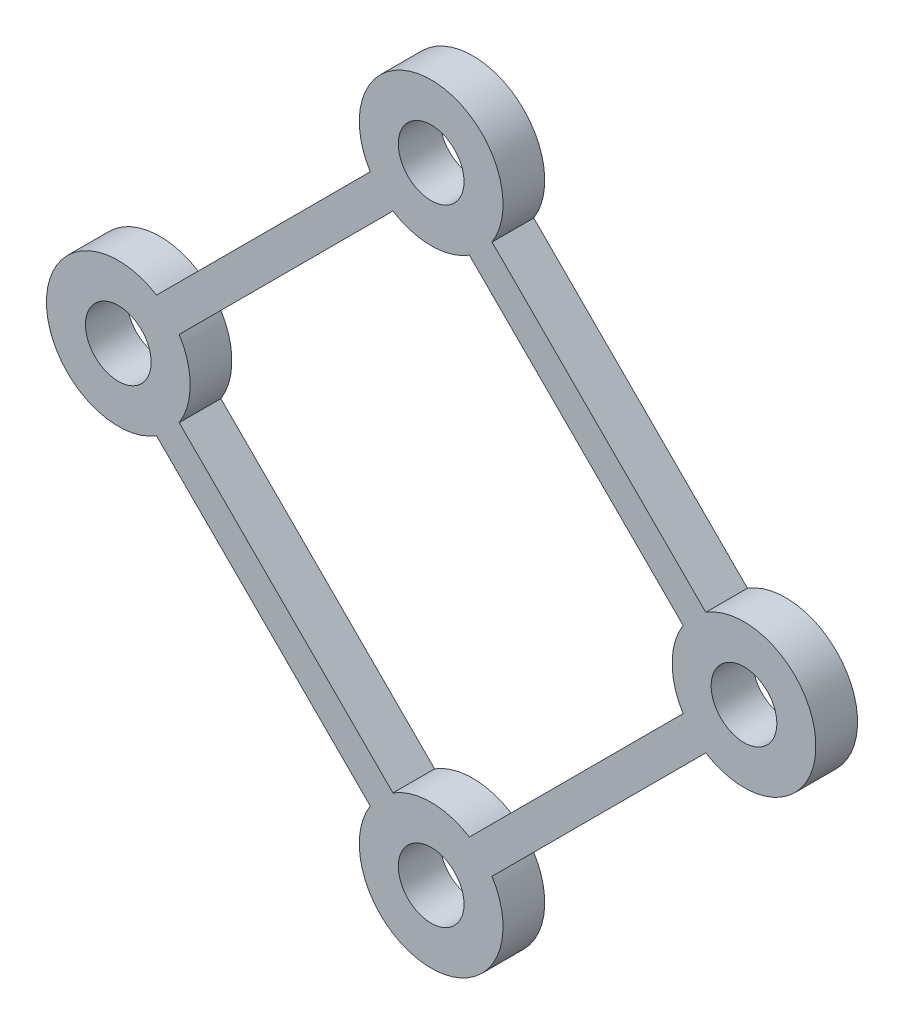
ISO-10303-21;
HEADER;
FILE_DESCRIPTION(('STEP AP214'),'2;1');
FILE_NAME('part.step','',(''),(''),'','','');
FILE_SCHEMA(('AUTOMOTIVE_DESIGN { 1 0 10303 214 1 1 1 1 }'));
ENDSEC;
DATA;
#1=APPLICATION_CONTEXT('core data for automotive mechanical design processes');
#2=APPLICATION_PROTOCOL_DEFINITION('international standard','automotive_design',2000,#1);
#3=PRODUCT_CONTEXT('',#1,'mechanical');
#4=PRODUCT('Part','Part','',(#3));
#5=PRODUCT_RELATED_PRODUCT_CATEGORY('part','',(#4));
#6=PRODUCT_DEFINITION_FORMATION('','',#4);
#7=PRODUCT_DEFINITION_CONTEXT('part definition',#1,'design');
#8=PRODUCT_DEFINITION('design','',#6,#7);
#9=PRODUCT_DEFINITION_SHAPE('','',#8);
#10=(LENGTH_UNIT() NAMED_UNIT(*) SI_UNIT(.MILLI.,.METRE.));
#11=(NAMED_UNIT(*) PLANE_ANGLE_UNIT() SI_UNIT($,.RADIAN.));
#12=(NAMED_UNIT(*) SI_UNIT($,.STERADIAN.) SOLID_ANGLE_UNIT());
#13=UNCERTAINTY_MEASURE_WITH_UNIT(LENGTH_MEASURE(1.E-05),#10,'distance_accuracy_value','');
#14=(GEOMETRIC_REPRESENTATION_CONTEXT(3) GLOBAL_UNCERTAINTY_ASSIGNED_CONTEXT((#13)) GLOBAL_UNIT_ASSIGNED_CONTEXT((#10,
#11,#12)) REPRESENTATION_CONTEXT('',''));
#15=CARTESIAN_POINT('',(0.,0.,0.));
#16=DIRECTION('',(0.,0.,1.));
#17=DIRECTION('',(1.,0.,0.));
#18=AXIS2_PLACEMENT_3D('',#15,#16,#17);
#19=CARTESIAN_POINT('',(3.42573895329532,3.22486475356174,3.3));
#20=DIRECTION('',(0.,0.,1.));
#21=DIRECTION('',(1.,0.,0.));
#22=AXIS2_PLACEMENT_3D('',#19,#20,#21);
#23=PLANE('',#22);
#24=CARTESIAN_POINT('',(13.1838125336697,-6.53320882681261,3.3));
#25=DIRECTION('',(0.,0.,1.));
#26=DIRECTION('',(1.,0.,0.));
#27=AXIS2_PLACEMENT_3D('',#24,#25,#26);
#28=CIRCLE('',#27,1.025);
#29=CARTESIAN_POINT('',(14.2088125336697,-6.53320882681261,3.3));
#30=VERTEX_POINT('',#29);
#31=EDGE_CURVE('E456',#30,#30,#28,.T.);
#32=ORIENTED_EDGE('',*,*,#31,.F.);
#33=EDGE_LOOP('',(#32));
#34=FACE_BOUND('',#33,.T.);
#35=CARTESIAN_POINT('',(-6.33233462707904,-6.53320882681261,3.3));
#36=DIRECTION('',(0.,0.,1.));
#37=DIRECTION('',(1.,0.,0.));
#38=AXIS2_PLACEMENT_3D('',#35,#36,#37);
#39=CIRCLE('',#38,1.025);
#40=CARTESIAN_POINT('',(-5.30733462707904,-6.53320882681261,3.3));
#41=VERTEX_POINT('',#40);
#42=EDGE_CURVE('E213',#41,#41,#39,.T.);
#43=ORIENTED_EDGE('',*,*,#42,.F.);
#44=EDGE_LOOP('',(#43));
#45=FACE_BOUND('',#44,.T.);
#46=CARTESIAN_POINT('',(3.42573895329532,3.22486475356174,3.3));
#47=DIRECTION('',(0.,0.,1.));
#48=DIRECTION('',(1.,0.,0.));
#49=AXIS2_PLACEMENT_3D('',#46,#47,#48);
#50=CIRCLE('',#49,2.24192641962564);
#51=CARTESIAN_POINT('',(5.3246457130271,2.03306477501651,3.3));
#52=VERTEX_POINT('',#51);
#53=CARTESIAN_POINT('',(1.52683219356354,2.03306477501651,3.3));
#54=VERTEX_POINT('',#53);
#55=EDGE_CURVE('E257',#52,#54,#50,.T.);
#56=ORIENTED_EDGE('',*,*,#55,.T.);
#57=DIRECTION('',(-0.707106781186548,-0.707106781186547,0.));
#58=VECTOR('',#57,1.);
#59=CARTESIAN_POINT('',(-5.14053464853381,-4.63430206708084,3.3));
#60=LINE('',#59,#58);
#61=CARTESIAN_POINT('',(-5.14053464853381,-4.63430206708084,3.3));
#62=VERTEX_POINT('',#61);
#63=EDGE_CURVE('E261',#54,#62,#60,.T.);
#64=ORIENTED_EDGE('',*,*,#63,.T.);
#65=CARTESIAN_POINT('',(-6.33233462707904,-6.53320882681261,3.3));
#66=DIRECTION('',(0.,0.,1.));
#67=DIRECTION('',(1.,0.,0.));
#68=AXIS2_PLACEMENT_3D('',#65,#66,#67);
#69=CIRCLE('',#68,2.24192641962564);
#70=CARTESIAN_POINT('',(-5.14053464853381,-8.43211558654439,3.3));
#71=VERTEX_POINT('',#70);
#72=EDGE_CURVE('E265',#62,#71,#69,.T.);
#73=ORIENTED_EDGE('',*,*,#72,.T.);
#74=DIRECTION('',(0.707106781186548,-0.707106781186548,0.));
#75=VECTOR('',#74,1.);
#76=CARTESIAN_POINT('',(-5.14053464853381,-8.43211558654439,3.3));
#77=LINE('',#76,#75);
#78=CARTESIAN_POINT('',(1.52683219356354,-15.0994824286417,3.3));
#79=VERTEX_POINT('',#78);
#80=EDGE_CURVE('E268',#71,#79,#77,.T.);
#81=ORIENTED_EDGE('',*,*,#80,.T.);
#82=CARTESIAN_POINT('',(3.42573895329532,-16.291282407187,3.3));
#83=DIRECTION('',(0.,0.,1.));
#84=DIRECTION('',(1.,0.,0.));
#85=AXIS2_PLACEMENT_3D('',#82,#83,#84);
#86=CIRCLE('',#85,2.24192641962564);
#87=CARTESIAN_POINT('',(5.32464571302709,-15.0994824286417,3.3));
#88=VERTEX_POINT('',#87);
#89=EDGE_CURVE('E271',#79,#88,#86,.T.);
#90=ORIENTED_EDGE('',*,*,#89,.T.);
#91=DIRECTION('',(0.707106781186547,0.707106781186548,0.));
#92=VECTOR('',#91,1.);
#93=CARTESIAN_POINT('',(5.32464571302709,-15.0994824286417,3.3));
#94=LINE('',#93,#92);
#95=CARTESIAN_POINT('',(11.9920125551244,-8.43211558654439,3.3));
#96=VERTEX_POINT('',#95);
#97=EDGE_CURVE('E274',#88,#96,#94,.T.);
#98=ORIENTED_EDGE('',*,*,#97,.T.);
#99=CARTESIAN_POINT('',(13.1838125336697,-6.53320882681261,3.3));
#100=DIRECTION('',(0.,0.,1.));
#101=DIRECTION('',(1.,0.,0.));
#102=AXIS2_PLACEMENT_3D('',#99,#100,#101);
#103=CIRCLE('',#102,2.24192641962564);
#104=CARTESIAN_POINT('',(11.9920125551244,-4.63430206708083,3.3));
#105=VERTEX_POINT('',#104);
#106=EDGE_CURVE('E277',#96,#105,#103,.T.);
#107=ORIENTED_EDGE('',*,*,#106,.T.);
#108=DIRECTION('',(-0.707106781186548,0.707106781186547,0.));
#109=VECTOR('',#108,1.);
#110=CARTESIAN_POINT('',(5.3246457130271,2.03306477501651,3.3));
#111=LINE('',#110,#109);
#112=EDGE_CURVE('E280',#105,#52,#111,.T.);
#113=ORIENTED_EDGE('',*,*,#112,.T.);
#114=EDGE_LOOP('',(#56,#64,#73,#81,#90,#98,#107,#113));
#115=FACE_BOUND('',#114,.T.);
#116=DIRECTION('',(0.707106781186548,-0.707106781186547,0.));
#117=VECTOR('',#116,1.);
#118=CARTESIAN_POINT('',(-4.43342786734726,-7.72500880535784,3.3));
#119=LINE('',#118,#117);
#120=CARTESIAN_POINT('',(-4.43342786734726,-7.72500880535784,3.3));
#121=VERTEX_POINT('',#120);
#122=CARTESIAN_POINT('',(2.23393897475009,-14.3923756474552,3.3));
#123=VERTEX_POINT('',#122);
#124=EDGE_CURVE('E174',#121,#123,#119,.T.);
#125=ORIENTED_EDGE('',*,*,#124,.F.);
#126=CARTESIAN_POINT('',(-6.33233462707904,-6.53320882681261,3.3));
#127=DIRECTION('',(0.,0.,-1.));
#128=DIRECTION('',(1.,0.,0.));
#129=AXIS2_PLACEMENT_3D('',#126,#127,#128);
#130=CIRCLE('',#129,2.24192641962564);
#131=CARTESIAN_POINT('',(-4.43342786734726,-5.34140884826738,3.3));
#132=VERTEX_POINT('',#131);
#133=EDGE_CURVE('E165',#132,#121,#130,.T.);
#134=ORIENTED_EDGE('',*,*,#133,.F.);
#135=DIRECTION('',(-0.707106781186548,-0.707106781186547,0.));
#136=VECTOR('',#135,1.);
#137=CARTESIAN_POINT('',(-4.43342786734726,-5.34140884826738,3.3));
#138=LINE('',#137,#136);
#139=CARTESIAN_POINT('',(2.23393897475009,1.32595799382997,3.3));
#140=VERTEX_POINT('',#139);
#141=EDGE_CURVE('E208',#140,#132,#138,.T.);
#142=ORIENTED_EDGE('',*,*,#141,.F.);
#143=CARTESIAN_POINT('',(3.42573895329532,3.22486475356174,3.3));
#144=DIRECTION('',(0.,0.,-1.));
#145=DIRECTION('',(1.,0.,0.));
#146=AXIS2_PLACEMENT_3D('',#143,#144,#145);
#147=CIRCLE('',#146,2.24192641962564);
#148=CARTESIAN_POINT('',(4.61753893184055,1.32595799382997,3.3));
#149=VERTEX_POINT('',#148);
#150=EDGE_CURVE('E205',#149,#140,#147,.T.);
#151=ORIENTED_EDGE('',*,*,#150,.F.);
#152=DIRECTION('',(-0.707106781186548,0.707106781186547,0.));
#153=VECTOR('',#152,1.);
#154=CARTESIAN_POINT('',(4.61753893184055,1.32595799382997,3.3));
#155=LINE('',#154,#153);
#156=CARTESIAN_POINT('',(11.2849057739379,-5.34140884826738,3.3));
#157=VERTEX_POINT('',#156);
#158=EDGE_CURVE('E202',#157,#149,#155,.T.);
#159=ORIENTED_EDGE('',*,*,#158,.F.);
#160=CARTESIAN_POINT('',(13.1838125336697,-6.53320882681261,3.3));
#161=DIRECTION('',(0.,0.,-1.));
#162=DIRECTION('',(1.,0.,0.));
#163=AXIS2_PLACEMENT_3D('',#160,#161,#162);
#164=CIRCLE('',#163,2.24192641962564);
#165=CARTESIAN_POINT('',(11.2849057739379,-7.72500880535785,3.3));
#166=VERTEX_POINT('',#165);
#167=EDGE_CURVE('E199',#166,#157,#164,.T.);
#168=ORIENTED_EDGE('',*,*,#167,.F.);
#169=DIRECTION('',(0.707106781186548,0.707106781186548,0.));
#170=VECTOR('',#169,1.);
#171=CARTESIAN_POINT('',(4.61753893184055,-14.3923756474552,3.3));
#172=LINE('',#171,#170);
#173=CARTESIAN_POINT('',(4.61753893184055,-14.3923756474552,3.3));
#174=VERTEX_POINT('',#173);
#175=EDGE_CURVE('E193',#174,#166,#172,.T.);
#176=ORIENTED_EDGE('',*,*,#175,.F.);
#177=CARTESIAN_POINT('',(3.42573895329532,-16.291282407187,3.3));
#178=DIRECTION('',(0.,0.,-1.));
#179=DIRECTION('',(1.,0.,0.));
#180=AXIS2_PLACEMENT_3D('',#177,#178,#179);
#181=CIRCLE('',#180,2.24192641962564);
#182=EDGE_CURVE('E189',#123,#174,#181,.T.);
#183=ORIENTED_EDGE('',*,*,#182,.F.);
#184=EDGE_LOOP('',(#125,#134,#142,#151,#159,#168,#176,#183));
#185=FACE_BOUND('',#184,.T.);
#186=CARTESIAN_POINT('',(3.42573895329532,3.22486475356174,3.3));
#187=DIRECTION('',(0.,0.,1.));
#188=DIRECTION('',(1.,0.,0.));
#189=AXIS2_PLACEMENT_3D('',#186,#187,#188);
#190=CIRCLE('',#189,1.025);
#191=CARTESIAN_POINT('',(4.45073895329532,3.22486475356174,3.3));
#192=VERTEX_POINT('',#191);
#193=EDGE_CURVE('E464',#192,#192,#190,.T.);
#194=ORIENTED_EDGE('',*,*,#193,.F.);
#195=EDGE_LOOP('',(#194));
#196=FACE_BOUND('',#195,.T.);
#197=CARTESIAN_POINT('',(3.42573895329532,-16.291282407187,3.3));
#198=DIRECTION('',(0.,0.,1.));
#199=DIRECTION('',(1.,0.,0.));
#200=AXIS2_PLACEMENT_3D('',#197,#198,#199);
#201=CIRCLE('',#200,1.025);
#202=CARTESIAN_POINT('',(4.45073895329532,-16.291282407187,3.3));
#203=VERTEX_POINT('',#202);
#204=EDGE_CURVE('E445',#203,#203,#201,.T.);
#205=ORIENTED_EDGE('',*,*,#204,.F.);
#206=EDGE_LOOP('',(#205));
#207=FACE_BOUND('',#206,.T.);
#208=ADVANCED_FACE('F51',(#34,#45,#115,#185,#196,#207),#23,.T.);
#209=CARTESIAN_POINT('',(3.42573895329532,3.22486475356174,2.));
#210=DIRECTION('',(0.,0.,1.));
#211=DIRECTION('',(1.,0.,0.));
#212=AXIS2_PLACEMENT_3D('',#209,#210,#211);
#213=PLANE('',#212);
#214=CARTESIAN_POINT('',(3.42573895329532,3.22486475356174,2.));
#215=DIRECTION('',(0.,0.,1.));
#216=DIRECTION('',(1.,0.,0.));
#217=AXIS2_PLACEMENT_3D('',#214,#215,#216);
#218=CIRCLE('',#217,2.24192641962564);
#219=CARTESIAN_POINT('',(5.3246457130271,2.03306477501651,2.));
#220=VERTEX_POINT('',#219);
#221=CARTESIAN_POINT('',(1.52683219356354,2.03306477501651,2.));
#222=VERTEX_POINT('',#221);
#223=EDGE_CURVE('E183',#220,#222,#218,.T.);
#224=ORIENTED_EDGE('',*,*,#223,.F.);
#225=DIRECTION('',(-0.707106781186548,0.707106781186547,0.));
#226=VECTOR('',#225,1.);
#227=CARTESIAN_POINT('',(5.3246457130271,2.03306477501651,2.));
#228=LINE('',#227,#226);
#229=CARTESIAN_POINT('',(11.9920125551244,-4.63430206708083,2.));
#230=VERTEX_POINT('',#229);
#231=EDGE_CURVE('E262',#230,#220,#228,.T.);
#232=ORIENTED_EDGE('',*,*,#231,.F.);
#233=CARTESIAN_POINT('',(13.1838125336697,-6.53320882681261,2.));
#234=DIRECTION('',(0.,0.,1.));
#235=DIRECTION('',(1.,0.,0.));
#236=AXIS2_PLACEMENT_3D('',#233,#234,#235);
#237=CIRCLE('',#236,2.24192641962564);
#238=CARTESIAN_POINT('',(11.9920125551244,-8.43211558654439,2.));
#239=VERTEX_POINT('',#238);
#240=EDGE_CURVE('E302',#239,#230,#237,.T.);
#241=ORIENTED_EDGE('',*,*,#240,.F.);
#242=DIRECTION('',(0.707106781186547,0.707106781186548,0.));
#243=VECTOR('',#242,1.);
#244=CARTESIAN_POINT('',(5.32464571302709,-15.0994824286417,2.));
#245=LINE('',#244,#243);
#246=CARTESIAN_POINT('',(5.32464571302709,-15.0994824286417,2.));
#247=VERTEX_POINT('',#246);
#248=EDGE_CURVE('E299',#247,#239,#245,.T.);
#249=ORIENTED_EDGE('',*,*,#248,.F.);
#250=CARTESIAN_POINT('',(3.42573895329532,-16.291282407187,2.));
#251=DIRECTION('',(0.,0.,1.));
#252=DIRECTION('',(1.,0.,0.));
#253=AXIS2_PLACEMENT_3D('',#250,#251,#252);
#254=CIRCLE('',#253,2.24192641962564);
#255=CARTESIAN_POINT('',(1.52683219356354,-15.0994824286417,2.));
#256=VERTEX_POINT('',#255);
#257=EDGE_CURVE('E296',#256,#247,#254,.T.);
#258=ORIENTED_EDGE('',*,*,#257,.F.);
#259=DIRECTION('',(0.707106781186548,-0.707106781186548,0.));
#260=VECTOR('',#259,1.);
#261=CARTESIAN_POINT('',(-5.14053464853381,-8.43211558654439,2.));
#262=LINE('',#261,#260);
#263=CARTESIAN_POINT('',(-5.14053464853381,-8.43211558654439,2.));
#264=VERTEX_POINT('',#263);
#265=EDGE_CURVE('E293',#264,#256,#262,.T.);
#266=ORIENTED_EDGE('',*,*,#265,.F.);
#267=CARTESIAN_POINT('',(-6.33233462707904,-6.53320882681261,2.));
#268=DIRECTION('',(0.,0.,1.));
#269=DIRECTION('',(1.,0.,0.));
#270=AXIS2_PLACEMENT_3D('',#267,#268,#269);
#271=CIRCLE('',#270,2.24192641962564);
#272=CARTESIAN_POINT('',(-5.14053464853381,-4.63430206708084,2.));
#273=VERTEX_POINT('',#272);
#274=EDGE_CURVE('E290',#273,#264,#271,.T.);
#275=ORIENTED_EDGE('',*,*,#274,.F.);
#276=DIRECTION('',(-0.707106781186548,-0.707106781186547,0.));
#277=VECTOR('',#276,1.);
#278=CARTESIAN_POINT('',(-5.14053464853381,-4.63430206708084,2.));
#279=LINE('',#278,#277);
#280=EDGE_CURVE('E287',#222,#273,#279,.T.);
#281=ORIENTED_EDGE('',*,*,#280,.F.);
#282=EDGE_LOOP('',(#224,#232,#241,#249,#258,#266,#275,#281));
#283=FACE_BOUND('',#282,.T.);
#284=CARTESIAN_POINT('',(-6.33233462707904,-6.53320882681261,2.));
#285=DIRECTION('',(0.,0.,-1.));
#286=DIRECTION('',(1.,0.,0.));
#287=AXIS2_PLACEMENT_3D('',#284,#285,#286);
#288=CIRCLE('',#287,2.24192641962564);
#289=CARTESIAN_POINT('',(-4.43342786734726,-5.34140884826738,2.));
#290=VERTEX_POINT('',#289);
#291=CARTESIAN_POINT('',(-4.43342786734726,-7.72500880535784,2.));
#292=VERTEX_POINT('',#291);
#293=EDGE_CURVE('E75',#290,#292,#288,.T.);
#294=ORIENTED_EDGE('',*,*,#293,.T.);
#295=DIRECTION('',(0.707106781186548,-0.707106781186547,0.));
#296=VECTOR('',#295,1.);
#297=CARTESIAN_POINT('',(-4.43342786734726,-7.72500880535784,2.));
#298=LINE('',#297,#296);
#299=CARTESIAN_POINT('',(2.23393897475009,-14.3923756474552,2.));
#300=VERTEX_POINT('',#299);
#301=EDGE_CURVE('E181',#292,#300,#298,.T.);
#302=ORIENTED_EDGE('',*,*,#301,.T.);
#303=CARTESIAN_POINT('',(3.42573895329532,-16.291282407187,2.));
#304=DIRECTION('',(0.,0.,-1.));
#305=DIRECTION('',(1.,0.,0.));
#306=AXIS2_PLACEMENT_3D('',#303,#304,#305);
#307=CIRCLE('',#306,2.24192641962564);
#308=CARTESIAN_POINT('',(4.61753893184055,-14.3923756474552,2.));
#309=VERTEX_POINT('',#308);
#310=EDGE_CURVE('E216',#300,#309,#307,.T.);
#311=ORIENTED_EDGE('',*,*,#310,.T.);
#312=DIRECTION('',(0.707106781186548,0.707106781186548,0.));
#313=VECTOR('',#312,1.);
#314=CARTESIAN_POINT('',(4.61753893184055,-14.3923756474552,2.));
#315=LINE('',#314,#313);
#316=CARTESIAN_POINT('',(11.2849057739379,-7.72500880535785,2.));
#317=VERTEX_POINT('',#316);
#318=EDGE_CURVE('E220',#309,#317,#315,.T.);
#319=ORIENTED_EDGE('',*,*,#318,.T.);
#320=CARTESIAN_POINT('',(13.1838125336697,-6.53320882681261,2.));
#321=DIRECTION('',(0.,0.,-1.));
#322=DIRECTION('',(1.,0.,0.));
#323=AXIS2_PLACEMENT_3D('',#320,#321,#322);
#324=CIRCLE('',#323,2.24192641962564);
#325=CARTESIAN_POINT('',(11.2849057739379,-5.34140884826738,2.));
#326=VERTEX_POINT('',#325);
#327=EDGE_CURVE('E224',#317,#326,#324,.T.);
#328=ORIENTED_EDGE('',*,*,#327,.T.);
#329=DIRECTION('',(-0.707106781186548,0.707106781186547,0.));
#330=VECTOR('',#329,1.);
#331=CARTESIAN_POINT('',(4.61753893184055,1.32595799382997,2.));
#332=LINE('',#331,#330);
#333=CARTESIAN_POINT('',(4.61753893184055,1.32595799382997,2.));
#334=VERTEX_POINT('',#333);
#335=EDGE_CURVE('E228',#326,#334,#332,.T.);
#336=ORIENTED_EDGE('',*,*,#335,.T.);
#337=CARTESIAN_POINT('',(3.42573895329532,3.22486475356174,2.));
#338=DIRECTION('',(0.,0.,-1.));
#339=DIRECTION('',(1.,0.,0.));
#340=AXIS2_PLACEMENT_3D('',#337,#338,#339);
#341=CIRCLE('',#340,2.24192641962564);
#342=CARTESIAN_POINT('',(2.23393897475009,1.32595799382997,2.));
#343=VERTEX_POINT('',#342);
#344=EDGE_CURVE('E232',#334,#343,#341,.T.);
#345=ORIENTED_EDGE('',*,*,#344,.T.);
#346=DIRECTION('',(-0.707106781186548,-0.707106781186547,0.));
#347=VECTOR('',#346,1.);
#348=CARTESIAN_POINT('',(-4.43342786734726,-5.34140884826738,2.));
#349=LINE('',#348,#347);
#350=EDGE_CURVE('E175',#343,#290,#349,.T.);
#351=ORIENTED_EDGE('',*,*,#350,.T.);
#352=EDGE_LOOP('',(#294,#302,#311,#319,#328,#336,#345,#351));
#353=FACE_BOUND('',#352,.T.);
#354=CARTESIAN_POINT('',(-6.33233462707904,-6.53320882681261,2.));
#355=DIRECTION('',(0.,0.,1.));
#356=DIRECTION('',(1.,0.,0.));
#357=AXIS2_PLACEMENT_3D('',#354,#355,#356);
#358=CIRCLE('',#357,1.025);
#359=CARTESIAN_POINT('',(-5.30733462707904,-6.53320882681261,2.));
#360=VERTEX_POINT('',#359);
#361=EDGE_CURVE('E468',#360,#360,#358,.T.);
#362=ORIENTED_EDGE('',*,*,#361,.T.);
#363=EDGE_LOOP('',(#362));
#364=FACE_BOUND('',#363,.T.);
#365=CARTESIAN_POINT('',(3.42573895329532,3.22486475356174,2.));
#366=DIRECTION('',(0.,0.,1.));
#367=DIRECTION('',(1.,0.,0.));
#368=AXIS2_PLACEMENT_3D('',#365,#366,#367);
#369=CIRCLE('',#368,1.025);
#370=CARTESIAN_POINT('',(4.45073895329532,3.22486475356174,2.));
#371=VERTEX_POINT('',#370);
#372=EDGE_CURVE('E460',#371,#371,#369,.T.);
#373=ORIENTED_EDGE('',*,*,#372,.T.);
#374=EDGE_LOOP('',(#373));
#375=FACE_BOUND('',#374,.T.);
#376=CARTESIAN_POINT('',(13.1838125336697,-6.53320882681261,2.));
#377=DIRECTION('',(0.,0.,1.));
#378=DIRECTION('',(1.,0.,0.));
#379=AXIS2_PLACEMENT_3D('',#376,#377,#378);
#380=CIRCLE('',#379,1.025);
#381=CARTESIAN_POINT('',(14.2088125336697,-6.53320882681261,2.));
#382=VERTEX_POINT('',#381);
#383=EDGE_CURVE('E453',#382,#382,#380,.T.);
#384=ORIENTED_EDGE('',*,*,#383,.T.);
#385=EDGE_LOOP('',(#384));
#386=FACE_BOUND('',#385,.T.);
#387=CARTESIAN_POINT('',(3.42573895329532,-16.291282407187,2.));
#388=DIRECTION('',(0.,0.,1.));
#389=DIRECTION('',(1.,0.,0.));
#390=AXIS2_PLACEMENT_3D('',#387,#388,#389);
#391=CIRCLE('',#390,1.025);
#392=CARTESIAN_POINT('',(4.45073895329532,-16.291282407187,2.));
#393=VERTEX_POINT('',#392);
#394=EDGE_CURVE('E448',#393,#393,#391,.T.);
#395=ORIENTED_EDGE('',*,*,#394,.T.);
#396=EDGE_LOOP('',(#395));
#397=FACE_BOUND('',#396,.T.);
#398=ADVANCED_FACE('F341',(#283,#353,#364,#375,#386,#397),#213,.F.);
#399=CARTESIAN_POINT('',(3.42573895329532,3.22486475356174,3.3));
#400=DIRECTION('',(0.,0.,-1.));
#401=DIRECTION('',(-1.,0.,0.));
#402=AXIS2_PLACEMENT_3D('',#399,#400,#401);
#403=CYLINDRICAL_SURFACE('',#402,2.24192641962564);
#404=ORIENTED_EDGE('',*,*,#223,.T.);
#405=DIRECTION('',(0.,0.,-1.));
#406=VECTOR('',#405,1.);
#407=CARTESIAN_POINT('',(1.52683219356354,2.03306477501651,3.3));
#408=LINE('',#407,#406);
#409=EDGE_CURVE('E11',#54,#222,#408,.T.);
#410=ORIENTED_EDGE('',*,*,#409,.F.);
#411=ORIENTED_EDGE('',*,*,#55,.F.);
#412=DIRECTION('',(0.,0.,-1.));
#413=VECTOR('',#412,1.);
#414=CARTESIAN_POINT('',(5.3246457130271,2.03306477501651,3.3));
#415=LINE('',#414,#413);
#416=EDGE_CURVE('E283',#52,#220,#415,.T.);
#417=ORIENTED_EDGE('',*,*,#416,.T.);
#418=EDGE_LOOP('',(#404,#410,#411,#417));
#419=FACE_BOUND('',#418,.T.);
#420=ADVANCED_FACE('F53',(#419),#403,.T.);
#421=CARTESIAN_POINT('',(-5.14053464853381,-4.63430206708084,3.3));
#422=DIRECTION('',(0.707106781186547,-0.707106781186548,0.));
#423=DIRECTION('',(0.707106781186548,0.707106781186547,0.));
#424=AXIS2_PLACEMENT_3D('',#421,#422,#423);
#425=PLANE('',#424);
#426=ORIENTED_EDGE('',*,*,#280,.T.);
#427=DIRECTION('',(0.,0.,-1.));
#428=VECTOR('',#427,1.);
#429=CARTESIAN_POINT('',(-5.14053464853381,-4.63430206708084,3.3));
#430=LINE('',#429,#428);
#431=EDGE_CURVE('E60',#62,#273,#430,.T.);
#432=ORIENTED_EDGE('',*,*,#431,.F.);
#433=ORIENTED_EDGE('',*,*,#63,.F.);
#434=ORIENTED_EDGE('',*,*,#409,.T.);
#435=EDGE_LOOP('',(#426,#432,#433,#434));
#436=FACE_BOUND('',#435,.T.);
#437=ADVANCED_FACE('F358',(#436),#425,.F.);
#438=CARTESIAN_POINT('',(-6.33233462707904,-6.53320882681261,3.3));
#439=DIRECTION('',(0.,0.,-1.));
#440=DIRECTION('',(-1.,0.,0.));
#441=AXIS2_PLACEMENT_3D('',#438,#439,#440);
#442=CYLINDRICAL_SURFACE('',#441,2.24192641962564);
#443=ORIENTED_EDGE('',*,*,#274,.T.);
#444=DIRECTION('',(0.,0.,-1.));
#445=VECTOR('',#444,1.);
#446=CARTESIAN_POINT('',(-5.14053464853381,-8.43211558654439,3.3));
#447=LINE('',#446,#445);
#448=EDGE_CURVE('E326',#71,#264,#447,.T.);
#449=ORIENTED_EDGE('',*,*,#448,.F.);
#450=ORIENTED_EDGE('',*,*,#72,.F.);
#451=ORIENTED_EDGE('',*,*,#431,.T.);
#452=EDGE_LOOP('',(#443,#449,#450,#451));
#453=FACE_BOUND('',#452,.T.);
#454=ADVANCED_FACE('F335',(#453),#442,.T.);
#455=CARTESIAN_POINT('',(-5.14053464853381,-8.43211558654439,3.3));
#456=DIRECTION('',(0.707106781186548,0.707106781186548,0.));
#457=DIRECTION('',(-0.707106781186548,0.707106781186548,0.));
#458=AXIS2_PLACEMENT_3D('',#455,#456,#457);
#459=PLANE('',#458);
#460=ORIENTED_EDGE('',*,*,#265,.T.);
#461=DIRECTION('',(0.,0.,-1.));
#462=VECTOR('',#461,1.);
#463=CARTESIAN_POINT('',(1.52683219356354,-15.0994824286417,3.3));
#464=LINE('',#463,#462);
#465=EDGE_CURVE('E322',#79,#256,#464,.T.);
#466=ORIENTED_EDGE('',*,*,#465,.F.);
#467=ORIENTED_EDGE('',*,*,#80,.F.);
#468=ORIENTED_EDGE('',*,*,#448,.T.);
#469=EDGE_LOOP('',(#460,#466,#467,#468));
#470=FACE_BOUND('',#469,.T.);
#471=ADVANCED_FACE('F347',(#470),#459,.F.);
#472=CARTESIAN_POINT('',(3.42573895329532,-16.291282407187,3.3));
#473=DIRECTION('',(0.,0.,-1.));
#474=DIRECTION('',(-1.,0.,0.));
#475=AXIS2_PLACEMENT_3D('',#472,#473,#474);
#476=CYLINDRICAL_SURFACE('',#475,2.24192641962564);
#477=ORIENTED_EDGE('',*,*,#257,.T.);
#478=DIRECTION('',(0.,0.,-1.));
#479=VECTOR('',#478,1.);
#480=CARTESIAN_POINT('',(5.32464571302709,-15.0994824286417,3.3));
#481=LINE('',#480,#479);
#482=EDGE_CURVE('E318',#88,#247,#481,.T.);
#483=ORIENTED_EDGE('',*,*,#482,.F.);
#484=ORIENTED_EDGE('',*,*,#89,.F.);
#485=ORIENTED_EDGE('',*,*,#465,.T.);
#486=EDGE_LOOP('',(#477,#483,#484,#485));
#487=FACE_BOUND('',#486,.T.);
#488=ADVANCED_FACE('F351',(#487),#476,.T.);
#489=CARTESIAN_POINT('',(5.32464571302709,-15.0994824286417,3.3));
#490=DIRECTION('',(-0.707106781186548,0.707106781186547,0.));
#491=DIRECTION('',(-0.707106781186547,-0.707106781186548,0.));
#492=AXIS2_PLACEMENT_3D('',#489,#490,#491);
#493=PLANE('',#492);
#494=ORIENTED_EDGE('',*,*,#248,.T.);
#495=DIRECTION('',(0.,0.,-1.));
#496=VECTOR('',#495,1.);
#497=CARTESIAN_POINT('',(11.9920125551244,-8.43211558654439,3.3));
#498=LINE('',#497,#496);
#499=EDGE_CURVE('E314',#96,#239,#498,.T.);
#500=ORIENTED_EDGE('',*,*,#499,.F.);
#501=ORIENTED_EDGE('',*,*,#97,.F.);
#502=ORIENTED_EDGE('',*,*,#482,.T.);
#503=EDGE_LOOP('',(#494,#500,#501,#502));
#504=FACE_BOUND('',#503,.T.);
#505=ADVANCED_FACE('F371',(#504),#493,.F.);
#506=CARTESIAN_POINT('',(13.1838125336697,-6.53320882681261,3.3));
#507=DIRECTION('',(0.,0.,-1.));
#508=DIRECTION('',(-1.,0.,0.));
#509=AXIS2_PLACEMENT_3D('',#506,#507,#508);
#510=CYLINDRICAL_SURFACE('',#509,2.24192641962564);
#511=ORIENTED_EDGE('',*,*,#240,.T.);
#512=DIRECTION('',(0.,0.,-1.));
#513=VECTOR('',#512,1.);
#514=CARTESIAN_POINT('',(11.9920125551244,-4.63430206708083,3.3));
#515=LINE('',#514,#513);
#516=EDGE_CURVE('E310',#105,#230,#515,.T.);
#517=ORIENTED_EDGE('',*,*,#516,.F.);
#518=ORIENTED_EDGE('',*,*,#106,.F.);
#519=ORIENTED_EDGE('',*,*,#499,.T.);
#520=EDGE_LOOP('',(#511,#517,#518,#519));
#521=FACE_BOUND('',#520,.T.);
#522=ADVANCED_FACE('F369',(#521),#510,.T.);
#523=CARTESIAN_POINT('',(5.3246457130271,2.03306477501651,3.3));
#524=DIRECTION('',(-0.707106781186547,-0.707106781186548,0.));
#525=DIRECTION('',(0.707106781186548,-0.707106781186547,0.));
#526=AXIS2_PLACEMENT_3D('',#523,#524,#525);
#527=PLANE('',#526);
#528=ORIENTED_EDGE('',*,*,#231,.T.);
#529=ORIENTED_EDGE('',*,*,#416,.F.);
#530=ORIENTED_EDGE('',*,*,#112,.F.);
#531=ORIENTED_EDGE('',*,*,#516,.T.);
#532=EDGE_LOOP('',(#528,#529,#530,#531));
#533=FACE_BOUND('',#532,.T.);
#534=ADVANCED_FACE('F364',(#533),#527,.F.);
#535=CARTESIAN_POINT('',(-6.33233462707904,-6.53320882681261,3.3));
#536=DIRECTION('',(0.,0.,-1.));
#537=DIRECTION('',(-1.,0.,0.));
#538=AXIS2_PLACEMENT_3D('',#535,#536,#537);
#539=CYLINDRICAL_SURFACE('',#538,2.24192641962564);
#540=ORIENTED_EDGE('',*,*,#293,.F.);
#541=DIRECTION('',(0.,0.,-1.));
#542=VECTOR('',#541,1.);
#543=CARTESIAN_POINT('',(-4.43342786734726,-5.34140884826738,3.3));
#544=LINE('',#543,#542);
#545=EDGE_CURVE('E169',#132,#290,#544,.T.);
#546=ORIENTED_EDGE('',*,*,#545,.F.);
#547=ORIENTED_EDGE('',*,*,#133,.T.);
#548=DIRECTION('',(0.,0.,-1.));
#549=VECTOR('',#548,1.);
#550=CARTESIAN_POINT('',(-4.43342786734726,-7.72500880535784,3.3));
#551=LINE('',#550,#549);
#552=EDGE_CURVE('E168',#121,#292,#551,.T.);
#553=ORIENTED_EDGE('',*,*,#552,.T.);
#554=EDGE_LOOP('',(#540,#546,#547,#553));
#555=FACE_BOUND('',#554,.T.);
#556=ADVANCED_FACE('F167',(#555),#539,.T.);
#557=CARTESIAN_POINT('',(-4.43342786734726,-7.72500880535784,3.3));
#558=DIRECTION('',(0.707106781186547,0.707106781186548,0.));
#559=DIRECTION('',(-0.707106781186548,0.707106781186547,0.));
#560=AXIS2_PLACEMENT_3D('',#557,#558,#559);
#561=PLANE('',#560);
#562=ORIENTED_EDGE('',*,*,#301,.F.);
#563=ORIENTED_EDGE('',*,*,#552,.F.);
#564=ORIENTED_EDGE('',*,*,#124,.T.);
#565=DIRECTION('',(0.,0.,-1.));
#566=VECTOR('',#565,1.);
#567=CARTESIAN_POINT('',(2.23393897475009,-14.3923756474552,3.3));
#568=LINE('',#567,#566);
#569=EDGE_CURVE('E184',#123,#300,#568,.T.);
#570=ORIENTED_EDGE('',*,*,#569,.T.);
#571=EDGE_LOOP('',(#562,#563,#564,#570));
#572=FACE_BOUND('',#571,.T.);
#573=ADVANCED_FACE('F178',(#572),#561,.T.);
#574=CARTESIAN_POINT('',(3.42573895329532,-16.291282407187,3.3));
#575=DIRECTION('',(0.,0.,-1.));
#576=DIRECTION('',(-1.,0.,0.));
#577=AXIS2_PLACEMENT_3D('',#574,#575,#576);
#578=CYLINDRICAL_SURFACE('',#577,2.24192641962564);
#579=ORIENTED_EDGE('',*,*,#310,.F.);
#580=ORIENTED_EDGE('',*,*,#569,.F.);
#581=ORIENTED_EDGE('',*,*,#182,.T.);
#582=DIRECTION('',(0.,0.,-1.));
#583=VECTOR('',#582,1.);
#584=CARTESIAN_POINT('',(4.61753893184055,-14.3923756474552,3.3));
#585=LINE('',#584,#583);
#586=EDGE_CURVE('E252',#174,#309,#585,.T.);
#587=ORIENTED_EDGE('',*,*,#586,.T.);
#588=EDGE_LOOP('',(#579,#580,#581,#587));
#589=FACE_BOUND('',#588,.T.);
#590=ADVANCED_FACE('F399',(#589),#578,.T.);
#591=CARTESIAN_POINT('',(4.61753893184055,-14.3923756474552,3.3));
#592=DIRECTION('',(-0.707106781186548,0.707106781186548,0.));
#593=DIRECTION('',(-0.707106781186548,-0.707106781186548,0.));
#594=AXIS2_PLACEMENT_3D('',#591,#592,#593);
#595=PLANE('',#594);
#596=ORIENTED_EDGE('',*,*,#318,.F.);
#597=ORIENTED_EDGE('',*,*,#586,.F.);
#598=ORIENTED_EDGE('',*,*,#175,.T.);
#599=DIRECTION('',(0.,0.,-1.));
#600=VECTOR('',#599,1.);
#601=CARTESIAN_POINT('',(11.2849057739379,-7.72500880535785,3.3));
#602=LINE('',#601,#600);
#603=EDGE_CURVE('E249',#166,#317,#602,.T.);
#604=ORIENTED_EDGE('',*,*,#603,.T.);
#605=EDGE_LOOP('',(#596,#597,#598,#604));
#606=FACE_BOUND('',#605,.T.);
#607=ADVANCED_FACE('F403',(#606),#595,.T.);
#608=CARTESIAN_POINT('',(13.1838125336697,-6.53320882681261,3.3));
#609=DIRECTION('',(0.,0.,-1.));
#610=DIRECTION('',(-1.,0.,0.));
#611=AXIS2_PLACEMENT_3D('',#608,#609,#610);
#612=CYLINDRICAL_SURFACE('',#611,2.24192641962564);
#613=ORIENTED_EDGE('',*,*,#327,.F.);
#614=ORIENTED_EDGE('',*,*,#603,.F.);
#615=ORIENTED_EDGE('',*,*,#167,.T.);
#616=DIRECTION('',(0.,0.,-1.));
#617=VECTOR('',#616,1.);
#618=CARTESIAN_POINT('',(11.2849057739379,-5.34140884826738,3.3));
#619=LINE('',#618,#617);
#620=EDGE_CURVE('E246',#157,#326,#619,.T.);
#621=ORIENTED_EDGE('',*,*,#620,.T.);
#622=EDGE_LOOP('',(#613,#614,#615,#621));
#623=FACE_BOUND('',#622,.T.);
#624=ADVANCED_FACE('F409',(#623),#612,.T.);
#625=CARTESIAN_POINT('',(4.61753893184055,1.32595799382997,3.3));
#626=DIRECTION('',(-0.707106781186547,-0.707106781186548,0.));
#627=DIRECTION('',(0.707106781186548,-0.707106781186547,0.));
#628=AXIS2_PLACEMENT_3D('',#625,#626,#627);
#629=PLANE('',#628);
#630=ORIENTED_EDGE('',*,*,#335,.F.);
#631=ORIENTED_EDGE('',*,*,#620,.F.);
#632=ORIENTED_EDGE('',*,*,#158,.T.);
#633=DIRECTION('',(0.,0.,-1.));
#634=VECTOR('',#633,1.);
#635=CARTESIAN_POINT('',(4.61753893184055,1.32595799382997,3.3));
#636=LINE('',#635,#634);
#637=EDGE_CURVE('E243',#149,#334,#636,.T.);
#638=ORIENTED_EDGE('',*,*,#637,.T.);
#639=EDGE_LOOP('',(#630,#631,#632,#638));
#640=FACE_BOUND('',#639,.T.);
#641=ADVANCED_FACE('F413',(#640),#629,.T.);
#642=CARTESIAN_POINT('',(3.42573895329532,3.22486475356174,3.3));
#643=DIRECTION('',(0.,0.,-1.));
#644=DIRECTION('',(-1.,0.,0.));
#645=AXIS2_PLACEMENT_3D('',#642,#643,#644);
#646=CYLINDRICAL_SURFACE('',#645,2.24192641962564);
#647=ORIENTED_EDGE('',*,*,#344,.F.);
#648=ORIENTED_EDGE('',*,*,#637,.F.);
#649=ORIENTED_EDGE('',*,*,#150,.T.);
#650=DIRECTION('',(0.,0.,-1.));
#651=VECTOR('',#650,1.);
#652=CARTESIAN_POINT('',(2.23393897475009,1.32595799382997,3.3));
#653=LINE('',#652,#651);
#654=EDGE_CURVE('E67',#140,#343,#653,.T.);
#655=ORIENTED_EDGE('',*,*,#654,.T.);
#656=EDGE_LOOP('',(#647,#648,#649,#655));
#657=FACE_BOUND('',#656,.T.);
#658=ADVANCED_FACE('F417',(#657),#646,.T.);
#659=CARTESIAN_POINT('',(-4.43342786734726,-5.34140884826738,3.3));
#660=DIRECTION('',(0.707106781186547,-0.707106781186548,0.));
#661=DIRECTION('',(0.707106781186548,0.707106781186547,0.));
#662=AXIS2_PLACEMENT_3D('',#659,#660,#661);
#663=PLANE('',#662);
#664=ORIENTED_EDGE('',*,*,#350,.F.);
#665=ORIENTED_EDGE('',*,*,#654,.F.);
#666=ORIENTED_EDGE('',*,*,#141,.T.);
#667=ORIENTED_EDGE('',*,*,#545,.T.);
#668=EDGE_LOOP('',(#664,#665,#666,#667));
#669=FACE_BOUND('',#668,.T.);
#670=ADVANCED_FACE('F421',(#669),#663,.T.);
#671=CARTESIAN_POINT('',(-6.33233462707904,-6.53320882681261,3.3));
#672=DIRECTION('',(0.,0.,-1.));
#673=DIRECTION('',(-1.,0.,0.));
#674=AXIS2_PLACEMENT_3D('',#671,#672,#673);
#675=CYLINDRICAL_SURFACE('',#674,1.025);
#676=ORIENTED_EDGE('',*,*,#42,.T.);
#677=EDGE_LOOP('',(#676));
#678=FACE_BOUND('',#677,.T.);
#679=ORIENTED_EDGE('',*,*,#361,.F.);
#680=EDGE_LOOP('',(#679));
#681=FACE_BOUND('',#680,.T.);
#682=ADVANCED_FACE('F425',(#678,#681),#675,.F.);
#683=CARTESIAN_POINT('',(3.42573895329532,3.22486475356174,3.3));
#684=DIRECTION('',(0.,0.,-1.));
#685=DIRECTION('',(-1.,0.,0.));
#686=AXIS2_PLACEMENT_3D('',#683,#684,#685);
#687=CYLINDRICAL_SURFACE('',#686,1.025);
#688=ORIENTED_EDGE('',*,*,#193,.T.);
#689=EDGE_LOOP('',(#688));
#690=FACE_BOUND('',#689,.T.);
#691=ORIENTED_EDGE('',*,*,#372,.F.);
#692=EDGE_LOOP('',(#691));
#693=FACE_BOUND('',#692,.T.);
#694=ADVANCED_FACE('F428',(#690,#693),#687,.F.);
#695=CARTESIAN_POINT('',(13.1838125336697,-6.53320882681261,3.3));
#696=DIRECTION('',(0.,0.,-1.));
#697=DIRECTION('',(-1.,0.,0.));
#698=AXIS2_PLACEMENT_3D('',#695,#696,#697);
#699=CYLINDRICAL_SURFACE('',#698,1.025);
#700=ORIENTED_EDGE('',*,*,#31,.T.);
#701=EDGE_LOOP('',(#700));
#702=FACE_BOUND('',#701,.T.);
#703=ORIENTED_EDGE('',*,*,#383,.F.);
#704=EDGE_LOOP('',(#703));
#705=FACE_BOUND('',#704,.T.);
#706=ADVANCED_FACE('F432',(#702,#705),#699,.F.);
#707=CARTESIAN_POINT('',(3.42573895329532,-16.291282407187,3.3));
#708=DIRECTION('',(0.,0.,-1.));
#709=DIRECTION('',(-1.,0.,0.));
#710=AXIS2_PLACEMENT_3D('',#707,#708,#709);
#711=CYLINDRICAL_SURFACE('',#710,1.025);
#712=ORIENTED_EDGE('',*,*,#204,.T.);
#713=EDGE_LOOP('',(#712));
#714=FACE_BOUND('',#713,.T.);
#715=ORIENTED_EDGE('',*,*,#394,.F.);
#716=EDGE_LOOP('',(#715));
#717=FACE_BOUND('',#716,.T.);
#718=ADVANCED_FACE('F436',(#714,#717),#711,.F.);
#719=CLOSED_SHELL('',(#208,#398,#420,#437,#454,#471,#488,#505,#522,#534,#556,#573,#590,#607,
#624,#641,#658,#670,#682,#694,#706,#718));
#720=MANIFOLD_SOLID_BREP('B2',#719);
#721=ADVANCED_BREP_SHAPE_REPRESENTATION('',(#18,#720),#14);
#722=SHAPE_DEFINITION_REPRESENTATION(#9,#721);
ENDSEC;
END-ISO-10303-21;
